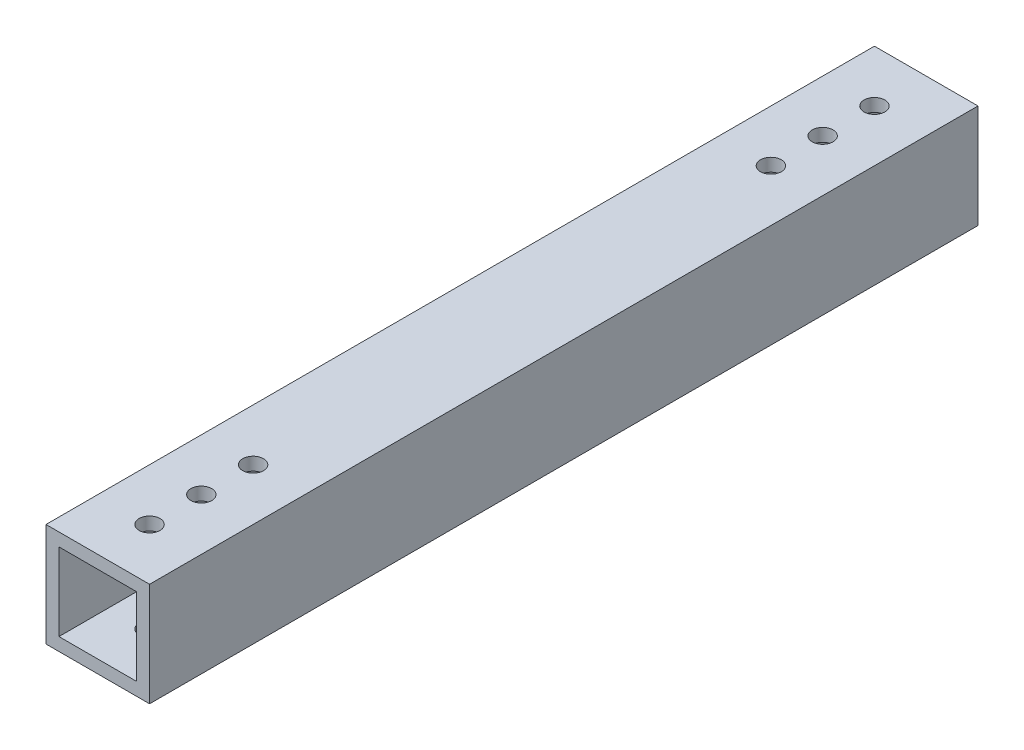
ISO-10303-21;
HEADER;
FILE_DESCRIPTION(('STEP AP214'),'2;1');
FILE_NAME('part.step','',(''),(''),'','','');
FILE_SCHEMA(('AUTOMOTIVE_DESIGN { 1 0 10303 214 1 1 1 1 }'));
ENDSEC;
DATA;
#1=APPLICATION_CONTEXT('core data for automotive mechanical design processes');
#2=APPLICATION_PROTOCOL_DEFINITION('international standard','automotive_design',2000,#1);
#3=PRODUCT_CONTEXT('',#1,'mechanical');
#4=PRODUCT('Part','Part','',(#3));
#5=PRODUCT_RELATED_PRODUCT_CATEGORY('part','',(#4));
#6=PRODUCT_DEFINITION_FORMATION('','',#4);
#7=PRODUCT_DEFINITION_CONTEXT('part definition',#1,'design');
#8=PRODUCT_DEFINITION('design','',#6,#7);
#9=PRODUCT_DEFINITION_SHAPE('','',#8);
#10=(LENGTH_UNIT() NAMED_UNIT(*) SI_UNIT(.MILLI.,.METRE.));
#11=(NAMED_UNIT(*) PLANE_ANGLE_UNIT() SI_UNIT($,.RADIAN.));
#12=(NAMED_UNIT(*) SI_UNIT($,.STERADIAN.) SOLID_ANGLE_UNIT());
#13=UNCERTAINTY_MEASURE_WITH_UNIT(LENGTH_MEASURE(1.E-05),#10,'distance_accuracy_value','');
#14=(GEOMETRIC_REPRESENTATION_CONTEXT(3) GLOBAL_UNCERTAINTY_ASSIGNED_CONTEXT((#13)) GLOBAL_UNIT_ASSIGNED_CONTEXT((#10,
#11,#12)) REPRESENTATION_CONTEXT('',''));
#15=CARTESIAN_POINT('',(0.,0.,0.));
#16=DIRECTION('',(0.,0.,1.));
#17=DIRECTION('',(1.,0.,0.));
#18=AXIS2_PLACEMENT_3D('',#15,#16,#17);
#19=CARTESIAN_POINT('',(0.,0.,203.2));
#20=DIRECTION('',(0.,1.,0.));
#21=DIRECTION('',(-1.,0.,0.));
#22=AXIS2_PLACEMENT_3D('',#19,#20,#21);
#23=PLANE('',#22);
#24=CARTESIAN_POINT('',(-12.7,0.,25.4));
#25=DIRECTION('',(0.,1.,0.));
#26=DIRECTION('',(-1.,0.,0.));
#27=AXIS2_PLACEMENT_3D('',#24,#25,#26);
#28=CIRCLE('',#27,2.55269999999999);
#29=CARTESIAN_POINT('',(-15.2527,0.,25.4));
#30=VERTEX_POINT('',#29);
#31=EDGE_CURVE('E204',#30,#30,#28,.F.);
#32=ORIENTED_EDGE('',*,*,#31,.F.);
#33=EDGE_LOOP('',(#32));
#34=FACE_BOUND('',#33,.T.);
#35=CARTESIAN_POINT('',(-12.7,0.,38.1));
#36=DIRECTION('',(0.,1.,0.));
#37=DIRECTION('',(-1.,0.,0.));
#38=AXIS2_PLACEMENT_3D('',#35,#36,#37);
#39=CIRCLE('',#38,2.55269999999999);
#40=CARTESIAN_POINT('',(-15.2527,0.,38.1));
#41=VERTEX_POINT('',#40);
#42=EDGE_CURVE('E198',#41,#41,#39,.F.);
#43=ORIENTED_EDGE('',*,*,#42,.F.);
#44=EDGE_LOOP('',(#43));
#45=FACE_BOUND('',#44,.T.);
#46=DIRECTION('',(1.,0.,0.));
#47=VECTOR('',#46,1.);
#48=CARTESIAN_POINT('',(0.,0.,0.));
#49=LINE('',#48,#47);
#50=CARTESIAN_POINT('',(-25.4,0.,0.));
#51=VERTEX_POINT('',#50);
#52=CARTESIAN_POINT('',(0.,0.,0.));
#53=VERTEX_POINT('',#52);
#54=EDGE_CURVE('E163',#51,#53,#49,.T.);
#55=ORIENTED_EDGE('',*,*,#54,.T.);
#56=DIRECTION('',(0.,0.,-1.));
#57=VECTOR('',#56,1.);
#58=CARTESIAN_POINT('',(0.,0.,203.2));
#59=LINE('',#58,#57);
#60=CARTESIAN_POINT('',(0.,0.,203.2));
#61=VERTEX_POINT('',#60);
#62=EDGE_CURVE('E172',#61,#53,#59,.T.);
#63=ORIENTED_EDGE('',*,*,#62,.F.);
#64=DIRECTION('',(1.,0.,0.));
#65=VECTOR('',#64,1.);
#66=CARTESIAN_POINT('',(0.,0.,203.2));
#67=LINE('',#66,#65);
#68=CARTESIAN_POINT('',(-25.4,0.,203.2));
#69=VERTEX_POINT('',#68);
#70=EDGE_CURVE('E169',#69,#61,#67,.T.);
#71=ORIENTED_EDGE('',*,*,#70,.F.);
#72=DIRECTION('',(0.,0.,-1.));
#73=VECTOR('',#72,1.);
#74=CARTESIAN_POINT('',(-25.4,0.,203.2));
#75=LINE('',#74,#73);
#76=EDGE_CURVE('E187',#69,#51,#75,.T.);
#77=ORIENTED_EDGE('',*,*,#76,.T.);
#78=EDGE_LOOP('',(#55,#63,#71,#77));
#79=FACE_BOUND('',#78,.T.);
#80=CARTESIAN_POINT('',(-12.7,0.,12.7));
#81=DIRECTION('',(0.,1.,0.));
#82=DIRECTION('',(-1.,0.,0.));
#83=AXIS2_PLACEMENT_3D('',#80,#81,#82);
#84=CIRCLE('',#83,2.55269999999999);
#85=CARTESIAN_POINT('',(-15.2527,0.,12.7));
#86=VERTEX_POINT('',#85);
#87=EDGE_CURVE('E210',#86,#86,#84,.F.);
#88=ORIENTED_EDGE('',*,*,#87,.F.);
#89=EDGE_LOOP('',(#88));
#90=FACE_BOUND('',#89,.T.);
#91=CARTESIAN_POINT('',(-12.7,0.,190.5));
#92=DIRECTION('',(0.,1.,0.));
#93=DIRECTION('',(-1.,0.,0.));
#94=AXIS2_PLACEMENT_3D('',#91,#92,#93);
#95=CIRCLE('',#94,2.55269999999999);
#96=CARTESIAN_POINT('',(-15.2527,0.,190.5));
#97=VERTEX_POINT('',#96);
#98=EDGE_CURVE('E215',#97,#97,#95,.F.);
#99=ORIENTED_EDGE('',*,*,#98,.F.);
#100=EDGE_LOOP('',(#99));
#101=FACE_BOUND('',#100,.T.);
#102=CARTESIAN_POINT('',(-12.7,0.,177.8));
#103=DIRECTION('',(0.,1.,0.));
#104=DIRECTION('',(-1.,0.,0.));
#105=AXIS2_PLACEMENT_3D('',#102,#103,#104);
#106=CIRCLE('',#105,2.55269999999999);
#107=CARTESIAN_POINT('',(-15.2527,0.,177.8));
#108=VERTEX_POINT('',#107);
#109=EDGE_CURVE('E220',#108,#108,#106,.F.);
#110=ORIENTED_EDGE('',*,*,#109,.F.);
#111=EDGE_LOOP('',(#110));
#112=FACE_BOUND('',#111,.T.);
#113=CARTESIAN_POINT('',(-12.7,0.,165.1));
#114=DIRECTION('',(0.,1.,0.));
#115=DIRECTION('',(-1.,0.,0.));
#116=AXIS2_PLACEMENT_3D('',#113,#114,#115);
#117=CIRCLE('',#116,2.55269999999999);
#118=CARTESIAN_POINT('',(-15.2527,0.,165.1));
#119=VERTEX_POINT('',#118);
#120=EDGE_CURVE('E354',#119,#119,#117,.F.);
#121=ORIENTED_EDGE('',*,*,#120,.F.);
#122=EDGE_LOOP('',(#121));
#123=FACE_BOUND('',#122,.T.);
#124=ADVANCED_FACE('F39',(#34,#45,#79,#90,#101,#112,#123),#23,.F.);
#125=CARTESIAN_POINT('',(0.,0.,203.2));
#126=DIRECTION('',(0.,0.,1.));
#127=DIRECTION('',(1.,0.,0.));
#128=AXIS2_PLACEMENT_3D('',#125,#126,#127);
#129=PLANE('',#128);
#130=DIRECTION('',(0.,1.,0.));
#131=VECTOR('',#130,1.);
#132=CARTESIAN_POINT('',(0.,0.,203.2));
#133=LINE('',#132,#131);
#134=CARTESIAN_POINT('',(0.,25.4,203.2));
#135=VERTEX_POINT('',#134);
#136=EDGE_CURVE('E158',#61,#135,#133,.T.);
#137=ORIENTED_EDGE('',*,*,#136,.T.);
#138=DIRECTION('',(-1.,0.,0.));
#139=VECTOR('',#138,1.);
#140=CARTESIAN_POINT('',(0.,25.4,203.2));
#141=LINE('',#140,#139);
#142=CARTESIAN_POINT('',(-25.4,25.4,203.2));
#143=VERTEX_POINT('',#142);
#144=EDGE_CURVE('E162',#135,#143,#141,.T.);
#145=ORIENTED_EDGE('',*,*,#144,.T.);
#146=DIRECTION('',(0.,-1.,0.));
#147=VECTOR('',#146,1.);
#148=CARTESIAN_POINT('',(-25.4,0.,203.2));
#149=LINE('',#148,#147);
#150=EDGE_CURVE('E166',#143,#69,#149,.T.);
#151=ORIENTED_EDGE('',*,*,#150,.T.);
#152=ORIENTED_EDGE('',*,*,#70,.T.);
#153=EDGE_LOOP('',(#137,#145,#151,#152));
#154=FACE_BOUND('',#153,.T.);
#155=DIRECTION('',(-1.,0.,0.));
#156=VECTOR('',#155,1.);
#157=CARTESIAN_POINT('',(-3.175,22.225,203.2));
#158=LINE('',#157,#156);
#159=CARTESIAN_POINT('',(-3.175,22.225,203.2));
#160=VERTEX_POINT('',#159);
#161=CARTESIAN_POINT('',(-22.225,22.225,203.2));
#162=VERTEX_POINT('',#161);
#163=EDGE_CURVE('E116',#160,#162,#158,.T.);
#164=ORIENTED_EDGE('',*,*,#163,.F.);
#165=DIRECTION('',(0.,1.,0.));
#166=VECTOR('',#165,1.);
#167=CARTESIAN_POINT('',(-3.175,3.175,203.2));
#168=LINE('',#167,#166);
#169=CARTESIAN_POINT('',(-3.175,3.175,203.2));
#170=VERTEX_POINT('',#169);
#171=EDGE_CURVE('E107',#170,#160,#168,.T.);
#172=ORIENTED_EDGE('',*,*,#171,.F.);
#173=DIRECTION('',(1.,0.,0.));
#174=VECTOR('',#173,1.);
#175=CARTESIAN_POINT('',(-3.175,3.175,203.2));
#176=LINE('',#175,#174);
#177=CARTESIAN_POINT('',(-22.225,3.175,203.2));
#178=VERTEX_POINT('',#177);
#179=EDGE_CURVE('E134',#178,#170,#176,.T.);
#180=ORIENTED_EDGE('',*,*,#179,.F.);
#181=DIRECTION('',(0.,-1.,0.));
#182=VECTOR('',#181,1.);
#183=CARTESIAN_POINT('',(-22.225,3.175,203.2));
#184=LINE('',#183,#182);
#185=EDGE_CURVE('E130',#162,#178,#184,.T.);
#186=ORIENTED_EDGE('',*,*,#185,.F.);
#187=EDGE_LOOP('',(#164,#172,#180,#186));
#188=FACE_BOUND('',#187,.T.);
#189=ADVANCED_FACE('F129',(#154,#188),#129,.T.);
#190=CARTESIAN_POINT('',(0.,0.,0.));
#191=DIRECTION('',(0.,0.,1.));
#192=DIRECTION('',(1.,0.,0.));
#193=AXIS2_PLACEMENT_3D('',#190,#191,#192);
#194=PLANE('',#193);
#195=DIRECTION('',(0.,1.,0.));
#196=VECTOR('',#195,1.);
#197=CARTESIAN_POINT('',(0.,0.,0.));
#198=LINE('',#197,#196);
#199=CARTESIAN_POINT('',(0.,25.4,0.));
#200=VERTEX_POINT('',#199);
#201=EDGE_CURVE('E125',#53,#200,#198,.T.);
#202=ORIENTED_EDGE('',*,*,#201,.F.);
#203=ORIENTED_EDGE('',*,*,#54,.F.);
#204=DIRECTION('',(0.,-1.,0.));
#205=VECTOR('',#204,1.);
#206=CARTESIAN_POINT('',(-25.4,0.,0.));
#207=LINE('',#206,#205);
#208=CARTESIAN_POINT('',(-25.4,25.4,0.));
#209=VERTEX_POINT('',#208);
#210=EDGE_CURVE('E179',#209,#51,#207,.T.);
#211=ORIENTED_EDGE('',*,*,#210,.F.);
#212=DIRECTION('',(-1.,0.,0.));
#213=VECTOR('',#212,1.);
#214=CARTESIAN_POINT('',(0.,25.4,0.));
#215=LINE('',#214,#213);
#216=EDGE_CURVE('E176',#200,#209,#215,.T.);
#217=ORIENTED_EDGE('',*,*,#216,.F.);
#218=EDGE_LOOP('',(#202,#203,#211,#217));
#219=FACE_BOUND('',#218,.T.);
#220=DIRECTION('',(0.,1.,0.));
#221=VECTOR('',#220,1.);
#222=CARTESIAN_POINT('',(-3.175,3.175,0.));
#223=LINE('',#222,#221);
#224=CARTESIAN_POINT('',(-3.175,3.175,0.));
#225=VERTEX_POINT('',#224);
#226=CARTESIAN_POINT('',(-3.175,22.225,0.));
#227=VERTEX_POINT('',#226);
#228=EDGE_CURVE('E65',#225,#227,#223,.T.);
#229=ORIENTED_EDGE('',*,*,#228,.T.);
#230=DIRECTION('',(-1.,0.,0.));
#231=VECTOR('',#230,1.);
#232=CARTESIAN_POINT('',(-3.175,22.225,0.));
#233=LINE('',#232,#231);
#234=CARTESIAN_POINT('',(-22.225,22.225,0.));
#235=VERTEX_POINT('',#234);
#236=EDGE_CURVE('E123',#227,#235,#233,.T.);
#237=ORIENTED_EDGE('',*,*,#236,.T.);
#238=DIRECTION('',(0.,-1.,0.));
#239=VECTOR('',#238,1.);
#240=CARTESIAN_POINT('',(-22.225,3.175,0.));
#241=LINE('',#240,#239);
#242=CARTESIAN_POINT('',(-22.225,3.175,0.));
#243=VERTEX_POINT('',#242);
#244=EDGE_CURVE('E145',#235,#243,#241,.T.);
#245=ORIENTED_EDGE('',*,*,#244,.T.);
#246=DIRECTION('',(1.,0.,0.));
#247=VECTOR('',#246,1.);
#248=CARTESIAN_POINT('',(-3.175,3.175,0.));
#249=LINE('',#248,#247);
#250=EDGE_CURVE('E117',#243,#225,#249,.T.);
#251=ORIENTED_EDGE('',*,*,#250,.T.);
#252=EDGE_LOOP('',(#229,#237,#245,#251));
#253=FACE_BOUND('',#252,.T.);
#254=ADVANCED_FACE('F303',(#219,#253),#194,.F.);
#255=CARTESIAN_POINT('',(0.,0.,203.2));
#256=DIRECTION('',(-1.,0.,0.));
#257=DIRECTION('',(0.,0.,1.));
#258=AXIS2_PLACEMENT_3D('',#255,#256,#257);
#259=PLANE('',#258);
#260=ORIENTED_EDGE('',*,*,#201,.T.);
#261=DIRECTION('',(0.,0.,-1.));
#262=VECTOR('',#261,1.);
#263=CARTESIAN_POINT('',(0.,25.4,203.2));
#264=LINE('',#263,#262);
#265=EDGE_CURVE('E11',#135,#200,#264,.T.);
#266=ORIENTED_EDGE('',*,*,#265,.F.);
#267=ORIENTED_EDGE('',*,*,#136,.F.);
#268=ORIENTED_EDGE('',*,*,#62,.T.);
#269=EDGE_LOOP('',(#260,#266,#267,#268));
#270=FACE_BOUND('',#269,.T.);
#271=ADVANCED_FACE('F41',(#270),#259,.F.);
#272=CARTESIAN_POINT('',(0.,25.4,203.2));
#273=DIRECTION('',(0.,-1.,0.));
#274=DIRECTION('',(1.,0.,0.));
#275=AXIS2_PLACEMENT_3D('',#272,#273,#274);
#276=PLANE('',#275);
#277=CARTESIAN_POINT('',(-12.7,25.4,165.1));
#278=DIRECTION('',(0.,1.,0.));
#279=DIRECTION('',(0.,0.,1.));
#280=AXIS2_PLACEMENT_3D('',#277,#278,#279);
#281=CIRCLE('',#280,2.55269999999999);
#282=CARTESIAN_POINT('',(-12.7,25.4,167.6527));
#283=VERTEX_POINT('',#282);
#284=EDGE_CURVE('E322',#283,#283,#281,.T.);
#285=ORIENTED_EDGE('',*,*,#284,.F.);
#286=EDGE_LOOP('',(#285));
#287=FACE_BOUND('',#286,.T.);
#288=CARTESIAN_POINT('',(-12.7,25.4,177.8));
#289=DIRECTION('',(0.,1.,0.));
#290=DIRECTION('',(0.,0.,1.));
#291=AXIS2_PLACEMENT_3D('',#288,#289,#290);
#292=CIRCLE('',#291,2.55269999999999);
#293=CARTESIAN_POINT('',(-12.7,25.4,180.3527));
#294=VERTEX_POINT('',#293);
#295=EDGE_CURVE('E229',#294,#294,#292,.T.);
#296=ORIENTED_EDGE('',*,*,#295,.F.);
#297=EDGE_LOOP('',(#296));
#298=FACE_BOUND('',#297,.T.);
#299=CARTESIAN_POINT('',(-12.7,25.4,190.5));
#300=DIRECTION('',(0.,1.,0.));
#301=DIRECTION('',(0.,0.,1.));
#302=AXIS2_PLACEMENT_3D('',#299,#300,#301);
#303=CIRCLE('',#302,2.55269999999999);
#304=CARTESIAN_POINT('',(-12.7,25.4,193.0527));
#305=VERTEX_POINT('',#304);
#306=EDGE_CURVE('E226',#305,#305,#303,.T.);
#307=ORIENTED_EDGE('',*,*,#306,.F.);
#308=EDGE_LOOP('',(#307));
#309=FACE_BOUND('',#308,.T.);
#310=CARTESIAN_POINT('',(-12.7,25.4,12.7));
#311=DIRECTION('',(0.,1.,0.));
#312=DIRECTION('',(0.,0.,1.));
#313=AXIS2_PLACEMENT_3D('',#310,#311,#312);
#314=CIRCLE('',#313,2.55269999999999);
#315=CARTESIAN_POINT('',(-12.7,25.4,15.2527));
#316=VERTEX_POINT('',#315);
#317=EDGE_CURVE('E249',#316,#316,#314,.T.);
#318=ORIENTED_EDGE('',*,*,#317,.F.);
#319=EDGE_LOOP('',(#318));
#320=FACE_BOUND('',#319,.T.);
#321=CARTESIAN_POINT('',(-12.7,25.4,25.4));
#322=DIRECTION('',(0.,1.,0.));
#323=DIRECTION('',(0.,0.,1.));
#324=AXIS2_PLACEMENT_3D('',#321,#322,#323);
#325=CIRCLE('',#324,2.55269999999999);
#326=CARTESIAN_POINT('',(-12.7,25.4,27.9527));
#327=VERTEX_POINT('',#326);
#328=EDGE_CURVE('E259',#327,#327,#325,.T.);
#329=ORIENTED_EDGE('',*,*,#328,.F.);
#330=EDGE_LOOP('',(#329));
#331=FACE_BOUND('',#330,.T.);
#332=CARTESIAN_POINT('',(-12.7,25.4,38.1));
#333=DIRECTION('',(0.,1.,0.));
#334=DIRECTION('',(0.,0.,1.));
#335=AXIS2_PLACEMENT_3D('',#332,#333,#334);
#336=CIRCLE('',#335,2.55269999999999);
#337=CARTESIAN_POINT('',(-12.7,25.4,40.6527));
#338=VERTEX_POINT('',#337);
#339=EDGE_CURVE('E269',#338,#338,#336,.T.);
#340=ORIENTED_EDGE('',*,*,#339,.F.);
#341=EDGE_LOOP('',(#340));
#342=FACE_BOUND('',#341,.T.);
#343=ORIENTED_EDGE('',*,*,#216,.T.);
#344=DIRECTION('',(0.,0.,-1.));
#345=VECTOR('',#344,1.);
#346=CARTESIAN_POINT('',(-25.4,25.4,203.2));
#347=LINE('',#346,#345);
#348=EDGE_CURVE('E49',#143,#209,#347,.T.);
#349=ORIENTED_EDGE('',*,*,#348,.F.);
#350=ORIENTED_EDGE('',*,*,#144,.F.);
#351=ORIENTED_EDGE('',*,*,#265,.T.);
#352=EDGE_LOOP('',(#343,#349,#350,#351));
#353=FACE_BOUND('',#352,.T.);
#354=ADVANCED_FACE('F311',(#287,#298,#309,#320,#331,#342,#353),#276,.F.);
#355=CARTESIAN_POINT('',(-25.4,0.,203.2));
#356=DIRECTION('',(1.,0.,0.));
#357=DIRECTION('',(0.,0.,-1.));
#358=AXIS2_PLACEMENT_3D('',#355,#356,#357);
#359=PLANE('',#358);
#360=ORIENTED_EDGE('',*,*,#210,.T.);
#361=ORIENTED_EDGE('',*,*,#76,.F.);
#362=ORIENTED_EDGE('',*,*,#150,.F.);
#363=ORIENTED_EDGE('',*,*,#348,.T.);
#364=EDGE_LOOP('',(#360,#361,#362,#363));
#365=FACE_BOUND('',#364,.T.);
#366=ADVANCED_FACE('F293',(#365),#359,.F.);
#367=CARTESIAN_POINT('',(-3.175,3.175,203.2));
#368=DIRECTION('',(-1.,0.,0.));
#369=DIRECTION('',(0.,0.,1.));
#370=AXIS2_PLACEMENT_3D('',#367,#368,#369);
#371=PLANE('',#370);
#372=ORIENTED_EDGE('',*,*,#228,.F.);
#373=DIRECTION('',(0.,0.,-1.));
#374=VECTOR('',#373,1.);
#375=CARTESIAN_POINT('',(-3.175,3.175,203.2));
#376=LINE('',#375,#374);
#377=EDGE_CURVE('E111',#170,#225,#376,.T.);
#378=ORIENTED_EDGE('',*,*,#377,.F.);
#379=ORIENTED_EDGE('',*,*,#171,.T.);
#380=DIRECTION('',(0.,0.,-1.));
#381=VECTOR('',#380,1.);
#382=CARTESIAN_POINT('',(-3.175,22.225,203.2));
#383=LINE('',#382,#381);
#384=EDGE_CURVE('E110',#160,#227,#383,.T.);
#385=ORIENTED_EDGE('',*,*,#384,.T.);
#386=EDGE_LOOP('',(#372,#378,#379,#385));
#387=FACE_BOUND('',#386,.T.);
#388=ADVANCED_FACE('F109',(#387),#371,.T.);
#389=CARTESIAN_POINT('',(-3.175,22.225,203.2));
#390=DIRECTION('',(0.,-1.,0.));
#391=DIRECTION('',(1.,0.,0.));
#392=AXIS2_PLACEMENT_3D('',#389,#390,#391);
#393=PLANE('',#392);
#394=CARTESIAN_POINT('',(-12.7,22.225,165.1));
#395=DIRECTION('',(0.,-1.,0.));
#396=DIRECTION('',(1.,0.,0.));
#397=AXIS2_PLACEMENT_3D('',#394,#395,#396);
#398=CIRCLE('',#397,2.55269999999999);
#399=CARTESIAN_POINT('',(-10.1473,22.225,165.1));
#400=VERTEX_POINT('',#399);
#401=EDGE_CURVE('E43',#400,#400,#398,.T.);
#402=ORIENTED_EDGE('',*,*,#401,.F.);
#403=EDGE_LOOP('',(#402));
#404=FACE_BOUND('',#403,.T.);
#405=CARTESIAN_POINT('',(-12.7,22.225,177.8));
#406=DIRECTION('',(0.,-1.,0.));
#407=DIRECTION('',(1.,0.,0.));
#408=AXIS2_PLACEMENT_3D('',#405,#406,#407);
#409=CIRCLE('',#408,2.55269999999999);
#410=CARTESIAN_POINT('',(-10.1473,22.225,177.8));
#411=VERTEX_POINT('',#410);
#412=EDGE_CURVE('E216',#411,#411,#409,.T.);
#413=ORIENTED_EDGE('',*,*,#412,.F.);
#414=EDGE_LOOP('',(#413));
#415=FACE_BOUND('',#414,.T.);
#416=CARTESIAN_POINT('',(-12.7,22.225,190.5));
#417=DIRECTION('',(0.,-1.,0.));
#418=DIRECTION('',(1.,0.,0.));
#419=AXIS2_PLACEMENT_3D('',#416,#417,#418);
#420=CIRCLE('',#419,2.55269999999999);
#421=CARTESIAN_POINT('',(-10.1473,22.225,190.5));
#422=VERTEX_POINT('',#421);
#423=EDGE_CURVE('E214',#422,#422,#420,.T.);
#424=ORIENTED_EDGE('',*,*,#423,.F.);
#425=EDGE_LOOP('',(#424));
#426=FACE_BOUND('',#425,.T.);
#427=CARTESIAN_POINT('',(-12.7,22.225,12.7));
#428=DIRECTION('',(0.,-1.,0.));
#429=DIRECTION('',(1.,0.,0.));
#430=AXIS2_PLACEMENT_3D('',#427,#428,#429);
#431=CIRCLE('',#430,2.55269999999999);
#432=CARTESIAN_POINT('',(-10.1473,22.225,12.7));
#433=VERTEX_POINT('',#432);
#434=EDGE_CURVE('E205',#433,#433,#431,.T.);
#435=ORIENTED_EDGE('',*,*,#434,.F.);
#436=EDGE_LOOP('',(#435));
#437=FACE_BOUND('',#436,.T.);
#438=CARTESIAN_POINT('',(-12.7,22.225,25.4));
#439=DIRECTION('',(0.,-1.,0.));
#440=DIRECTION('',(1.,0.,0.));
#441=AXIS2_PLACEMENT_3D('',#438,#439,#440);
#442=CIRCLE('',#441,2.55269999999999);
#443=CARTESIAN_POINT('',(-10.1473,22.225,25.4));
#444=VERTEX_POINT('',#443);
#445=EDGE_CURVE('E199',#444,#444,#442,.T.);
#446=ORIENTED_EDGE('',*,*,#445,.F.);
#447=EDGE_LOOP('',(#446));
#448=FACE_BOUND('',#447,.T.);
#449=CARTESIAN_POINT('',(-12.7,22.225,38.1));
#450=DIRECTION('',(0.,-1.,0.));
#451=DIRECTION('',(1.,0.,0.));
#452=AXIS2_PLACEMENT_3D('',#449,#450,#451);
#453=CIRCLE('',#452,2.55269999999999);
#454=CARTESIAN_POINT('',(-10.1473,22.225,38.1));
#455=VERTEX_POINT('',#454);
#456=EDGE_CURVE('E142',#455,#455,#453,.T.);
#457=ORIENTED_EDGE('',*,*,#456,.F.);
#458=EDGE_LOOP('',(#457));
#459=FACE_BOUND('',#458,.T.);
#460=ORIENTED_EDGE('',*,*,#236,.F.);
#461=ORIENTED_EDGE('',*,*,#384,.F.);
#462=ORIENTED_EDGE('',*,*,#163,.T.);
#463=DIRECTION('',(0.,0.,-1.));
#464=VECTOR('',#463,1.);
#465=CARTESIAN_POINT('',(-22.225,22.225,203.2));
#466=LINE('',#465,#464);
#467=EDGE_CURVE('E126',#162,#235,#466,.T.);
#468=ORIENTED_EDGE('',*,*,#467,.T.);
#469=EDGE_LOOP('',(#460,#461,#462,#468));
#470=FACE_BOUND('',#469,.T.);
#471=ADVANCED_FACE('F120',(#404,#415,#426,#437,#448,#459,#470),#393,.T.);
#472=CARTESIAN_POINT('',(-22.225,3.175,203.2));
#473=DIRECTION('',(1.,0.,0.));
#474=DIRECTION('',(0.,1.,0.));
#475=AXIS2_PLACEMENT_3D('',#472,#473,#474);
#476=PLANE('',#475);
#477=ORIENTED_EDGE('',*,*,#244,.F.);
#478=ORIENTED_EDGE('',*,*,#467,.F.);
#479=ORIENTED_EDGE('',*,*,#185,.T.);
#480=DIRECTION('',(0.,0.,-1.));
#481=VECTOR('',#480,1.);
#482=CARTESIAN_POINT('',(-22.225,3.175,203.2));
#483=LINE('',#482,#481);
#484=EDGE_CURVE('E57',#178,#243,#483,.T.);
#485=ORIENTED_EDGE('',*,*,#484,.T.);
#486=EDGE_LOOP('',(#477,#478,#479,#485));
#487=FACE_BOUND('',#486,.T.);
#488=ADVANCED_FACE('F283',(#487),#476,.T.);
#489=CARTESIAN_POINT('',(-3.175,3.175,203.2));
#490=DIRECTION('',(0.,1.,0.));
#491=DIRECTION('',(-1.,0.,0.));
#492=AXIS2_PLACEMENT_3D('',#489,#490,#491);
#493=PLANE('',#492);
#494=CARTESIAN_POINT('',(-12.7,3.175,165.1));
#495=DIRECTION('',(0.,1.,0.));
#496=DIRECTION('',(-1.,0.,0.));
#497=AXIS2_PLACEMENT_3D('',#494,#495,#496);
#498=CIRCLE('',#497,2.55269999999999);
#499=CARTESIAN_POINT('',(-15.2527,3.175,165.1));
#500=VERTEX_POINT('',#499);
#501=EDGE_CURVE('E235',#500,#500,#498,.T.);
#502=ORIENTED_EDGE('',*,*,#501,.F.);
#503=EDGE_LOOP('',(#502));
#504=FACE_BOUND('',#503,.T.);
#505=CARTESIAN_POINT('',(-12.7,3.175,177.8));
#506=DIRECTION('',(0.,1.,0.));
#507=DIRECTION('',(-1.,0.,0.));
#508=AXIS2_PLACEMENT_3D('',#505,#506,#507);
#509=CIRCLE('',#508,2.55269999999999);
#510=CARTESIAN_POINT('',(-15.2527,3.175,177.8));
#511=VERTEX_POINT('',#510);
#512=EDGE_CURVE('E219',#511,#511,#509,.T.);
#513=ORIENTED_EDGE('',*,*,#512,.F.);
#514=EDGE_LOOP('',(#513));
#515=FACE_BOUND('',#514,.T.);
#516=CARTESIAN_POINT('',(-12.7,3.175,190.5));
#517=DIRECTION('',(0.,1.,0.));
#518=DIRECTION('',(-1.,0.,0.));
#519=AXIS2_PLACEMENT_3D('',#516,#517,#518);
#520=CIRCLE('',#519,2.55269999999999);
#521=CARTESIAN_POINT('',(-15.2527,3.175,190.5));
#522=VERTEX_POINT('',#521);
#523=EDGE_CURVE('E211',#522,#522,#520,.T.);
#524=ORIENTED_EDGE('',*,*,#523,.F.);
#525=EDGE_LOOP('',(#524));
#526=FACE_BOUND('',#525,.T.);
#527=CARTESIAN_POINT('',(-12.7,3.175,12.7));
#528=DIRECTION('',(0.,1.,0.));
#529=DIRECTION('',(-1.,0.,0.));
#530=AXIS2_PLACEMENT_3D('',#527,#528,#529);
#531=CIRCLE('',#530,2.55269999999999);
#532=CARTESIAN_POINT('',(-15.2527,3.175,12.7));
#533=VERTEX_POINT('',#532);
#534=EDGE_CURVE('E209',#533,#533,#531,.T.);
#535=ORIENTED_EDGE('',*,*,#534,.F.);
#536=EDGE_LOOP('',(#535));
#537=FACE_BOUND('',#536,.T.);
#538=CARTESIAN_POINT('',(-12.7,3.175,25.4));
#539=DIRECTION('',(0.,1.,0.));
#540=DIRECTION('',(-1.,0.,0.));
#541=AXIS2_PLACEMENT_3D('',#538,#539,#540);
#542=CIRCLE('',#541,2.55269999999999);
#543=CARTESIAN_POINT('',(-15.2527,3.175,25.4));
#544=VERTEX_POINT('',#543);
#545=EDGE_CURVE('E203',#544,#544,#542,.T.);
#546=ORIENTED_EDGE('',*,*,#545,.F.);
#547=EDGE_LOOP('',(#546));
#548=FACE_BOUND('',#547,.T.);
#549=CARTESIAN_POINT('',(-12.7,3.175,38.1));
#550=DIRECTION('',(0.,1.,0.));
#551=DIRECTION('',(-1.,0.,0.));
#552=AXIS2_PLACEMENT_3D('',#549,#550,#551);
#553=CIRCLE('',#552,2.55269999999999);
#554=CARTESIAN_POINT('',(-15.2527,3.175,38.1));
#555=VERTEX_POINT('',#554);
#556=EDGE_CURVE('E194',#555,#555,#553,.T.);
#557=ORIENTED_EDGE('',*,*,#556,.F.);
#558=EDGE_LOOP('',(#557));
#559=FACE_BOUND('',#558,.T.);
#560=ORIENTED_EDGE('',*,*,#250,.F.);
#561=ORIENTED_EDGE('',*,*,#484,.F.);
#562=ORIENTED_EDGE('',*,*,#179,.T.);
#563=ORIENTED_EDGE('',*,*,#377,.T.);
#564=EDGE_LOOP('',(#560,#561,#562,#563));
#565=FACE_BOUND('',#564,.T.);
#566=ADVANCED_FACE('F290',(#504,#515,#526,#537,#548,#559,#565),#493,.T.);
#567=CARTESIAN_POINT('',(-12.7,25.4,38.1));
#568=DIRECTION('',(0.,1.,0.));
#569=DIRECTION('',(0.,0.,1.));
#570=AXIS2_PLACEMENT_3D('',#567,#568,#569);
#571=CYLINDRICAL_SURFACE('',#570,2.55269999999999);
#572=ORIENTED_EDGE('',*,*,#556,.T.);
#573=EDGE_LOOP('',(#572));
#574=FACE_BOUND('',#573,.T.);
#575=ORIENTED_EDGE('',*,*,#42,.T.);
#576=EDGE_LOOP('',(#575));
#577=FACE_BOUND('',#576,.T.);
#578=ADVANCED_FACE('F393',(#574,#577),#571,.F.);
#579=ORIENTED_EDGE('',*,*,#456,.T.);
#580=EDGE_LOOP('',(#579));
#581=FACE_BOUND('',#580,.T.);
#582=ORIENTED_EDGE('',*,*,#339,.T.);
#583=EDGE_LOOP('',(#582));
#584=FACE_BOUND('',#583,.T.);
#585=ADVANCED_FACE('F279',(#581,#584),#571,.F.);
#586=CARTESIAN_POINT('',(-12.7,25.4,25.4));
#587=DIRECTION('',(0.,1.,0.));
#588=DIRECTION('',(0.,0.,1.));
#589=AXIS2_PLACEMENT_3D('',#586,#587,#588);
#590=CYLINDRICAL_SURFACE('',#589,2.55269999999999);
#591=ORIENTED_EDGE('',*,*,#445,.T.);
#592=EDGE_LOOP('',(#591));
#593=FACE_BOUND('',#592,.T.);
#594=ORIENTED_EDGE('',*,*,#328,.T.);
#595=EDGE_LOOP('',(#594));
#596=FACE_BOUND('',#595,.T.);
#597=ADVANCED_FACE('F389',(#593,#596),#590,.F.);
#598=ORIENTED_EDGE('',*,*,#545,.T.);
#599=EDGE_LOOP('',(#598));
#600=FACE_BOUND('',#599,.T.);
#601=ORIENTED_EDGE('',*,*,#31,.T.);
#602=EDGE_LOOP('',(#601));
#603=FACE_BOUND('',#602,.T.);
#604=ADVANCED_FACE('F387',(#600,#603),#590,.F.);
#605=CARTESIAN_POINT('',(-12.7,25.4,12.7));
#606=DIRECTION('',(0.,1.,0.));
#607=DIRECTION('',(0.,0.,1.));
#608=AXIS2_PLACEMENT_3D('',#605,#606,#607);
#609=CYLINDRICAL_SURFACE('',#608,2.55269999999999);
#610=ORIENTED_EDGE('',*,*,#434,.T.);
#611=EDGE_LOOP('',(#610));
#612=FACE_BOUND('',#611,.T.);
#613=ORIENTED_EDGE('',*,*,#317,.T.);
#614=EDGE_LOOP('',(#613));
#615=FACE_BOUND('',#614,.T.);
#616=ADVANCED_FACE('F384',(#612,#615),#609,.F.);
#617=ORIENTED_EDGE('',*,*,#534,.T.);
#618=EDGE_LOOP('',(#617));
#619=FACE_BOUND('',#618,.T.);
#620=ORIENTED_EDGE('',*,*,#87,.T.);
#621=EDGE_LOOP('',(#620));
#622=FACE_BOUND('',#621,.T.);
#623=ADVANCED_FACE('F382',(#619,#622),#609,.F.);
#624=CARTESIAN_POINT('',(-12.7,25.4,190.5));
#625=DIRECTION('',(0.,1.,0.));
#626=DIRECTION('',(0.,0.,1.));
#627=AXIS2_PLACEMENT_3D('',#624,#625,#626);
#628=CYLINDRICAL_SURFACE('',#627,2.55269999999999);
#629=ORIENTED_EDGE('',*,*,#523,.T.);
#630=EDGE_LOOP('',(#629));
#631=FACE_BOUND('',#630,.T.);
#632=ORIENTED_EDGE('',*,*,#98,.T.);
#633=EDGE_LOOP('',(#632));
#634=FACE_BOUND('',#633,.T.);
#635=ADVANCED_FACE('F379',(#631,#634),#628,.F.);
#636=ORIENTED_EDGE('',*,*,#423,.T.);
#637=EDGE_LOOP('',(#636));
#638=FACE_BOUND('',#637,.T.);
#639=ORIENTED_EDGE('',*,*,#306,.T.);
#640=EDGE_LOOP('',(#639));
#641=FACE_BOUND('',#640,.T.);
#642=ADVANCED_FACE('F378',(#638,#641),#628,.F.);
#643=CARTESIAN_POINT('',(-12.7,25.4,177.8));
#644=DIRECTION('',(0.,1.,0.));
#645=DIRECTION('',(0.,0.,1.));
#646=AXIS2_PLACEMENT_3D('',#643,#644,#645);
#647=CYLINDRICAL_SURFACE('',#646,2.55269999999999);
#648=ORIENTED_EDGE('',*,*,#412,.T.);
#649=EDGE_LOOP('',(#648));
#650=FACE_BOUND('',#649,.T.);
#651=ORIENTED_EDGE('',*,*,#295,.T.);
#652=EDGE_LOOP('',(#651));
#653=FACE_BOUND('',#652,.T.);
#654=ADVANCED_FACE('F373',(#650,#653),#647,.F.);
#655=ORIENTED_EDGE('',*,*,#512,.T.);
#656=EDGE_LOOP('',(#655));
#657=FACE_BOUND('',#656,.T.);
#658=ORIENTED_EDGE('',*,*,#109,.T.);
#659=EDGE_LOOP('',(#658));
#660=FACE_BOUND('',#659,.T.);
#661=ADVANCED_FACE('F365',(#657,#660),#647,.F.);
#662=CARTESIAN_POINT('',(-12.7,25.4,165.1));
#663=DIRECTION('',(0.,1.,0.));
#664=DIRECTION('',(0.,0.,1.));
#665=AXIS2_PLACEMENT_3D('',#662,#663,#664);
#666=CYLINDRICAL_SURFACE('',#665,2.55269999999999);
#667=ORIENTED_EDGE('',*,*,#401,.T.);
#668=EDGE_LOOP('',(#667));
#669=FACE_BOUND('',#668,.T.);
#670=ORIENTED_EDGE('',*,*,#284,.T.);
#671=EDGE_LOOP('',(#670));
#672=FACE_BOUND('',#671,.T.);
#673=ADVANCED_FACE('F362',(#669,#672),#666,.F.);
#674=ORIENTED_EDGE('',*,*,#501,.T.);
#675=EDGE_LOOP('',(#674));
#676=FACE_BOUND('',#675,.T.);
#677=ORIENTED_EDGE('',*,*,#120,.T.);
#678=EDGE_LOOP('',(#677));
#679=FACE_BOUND('',#678,.T.);
#680=ADVANCED_FACE('F364',(#676,#679),#666,.F.);
#681=CLOSED_SHELL('',(#124,#189,#254,#271,#354,#366,#388,#471,#488,#566,#578,#585,#597,#604,
#616,#623,#635,#642,#654,#661,#673,#680));
#682=MANIFOLD_SOLID_BREP('B2',#681);
#683=ADVANCED_BREP_SHAPE_REPRESENTATION('',(#18,#682),#14);
#684=SHAPE_DEFINITION_REPRESENTATION(#9,#683);
ENDSEC;
END-ISO-10303-21;
